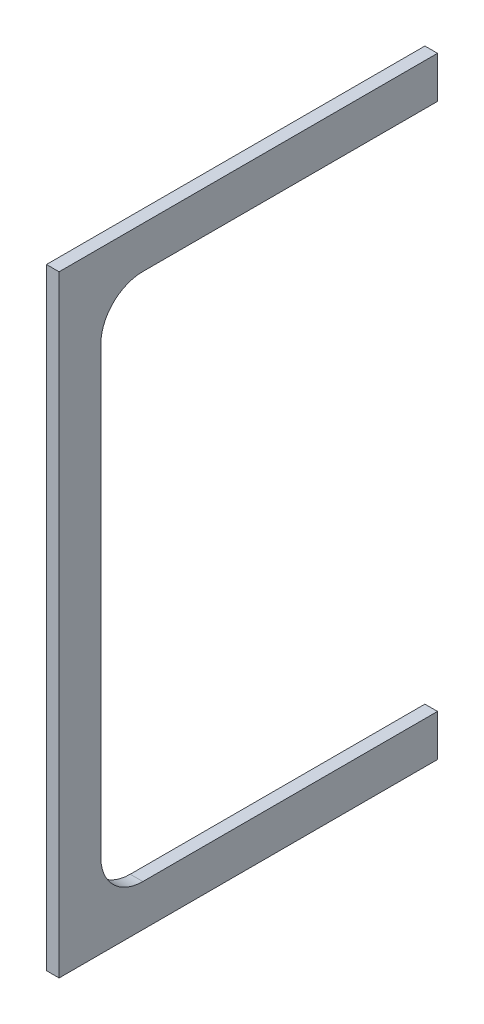
ISO-10303-21;
HEADER;
FILE_DESCRIPTION(('STEP AP214'),'2;1');
FILE_NAME('part.step','',(''),(''),'','','');
FILE_SCHEMA(('AUTOMOTIVE_DESIGN { 1 0 10303 214 1 1 1 1 }'));
ENDSEC;
DATA;
#1=APPLICATION_CONTEXT('core data for automotive mechanical design processes');
#2=APPLICATION_PROTOCOL_DEFINITION('international standard','automotive_design',2000,#1);
#3=PRODUCT_CONTEXT('',#1,'mechanical');
#4=PRODUCT('Part','Part','',(#3));
#5=PRODUCT_RELATED_PRODUCT_CATEGORY('part','',(#4));
#6=PRODUCT_DEFINITION_FORMATION('','',#4);
#7=PRODUCT_DEFINITION_CONTEXT('part definition',#1,'design');
#8=PRODUCT_DEFINITION('design','',#6,#7);
#9=PRODUCT_DEFINITION_SHAPE('','',#8);
#10=(LENGTH_UNIT() NAMED_UNIT(*) SI_UNIT(.MILLI.,.METRE.));
#11=(NAMED_UNIT(*) PLANE_ANGLE_UNIT() SI_UNIT($,.RADIAN.));
#12=(NAMED_UNIT(*) SI_UNIT($,.STERADIAN.) SOLID_ANGLE_UNIT());
#13=UNCERTAINTY_MEASURE_WITH_UNIT(LENGTH_MEASURE(1.E-05),#10,'distance_accuracy_value','');
#14=(GEOMETRIC_REPRESENTATION_CONTEXT(3) GLOBAL_UNCERTAINTY_ASSIGNED_CONTEXT((#13)) GLOBAL_UNIT_ASSIGNED_CONTEXT((#10,
#11,#12)) REPRESENTATION_CONTEXT('',''));
#15=CARTESIAN_POINT('',(0.,0.,0.));
#16=DIRECTION('',(0.,0.,1.));
#17=DIRECTION('',(1.,0.,0.));
#18=AXIS2_PLACEMENT_3D('',#15,#16,#17);
#19=CARTESIAN_POINT('',(1.5,148.4,-36.5));
#20=DIRECTION('',(0.,0.,-1.));
#21=DIRECTION('',(-1.,0.,0.));
#22=AXIS2_PLACEMENT_3D('',#19,#20,#21);
#23=PLANE('',#22);
#24=DIRECTION('',(0.,-1.,0.));
#25=VECTOR('',#24,1.);
#26=CARTESIAN_POINT('',(-1.5,148.4,-36.5));
#27=LINE('',#26,#25);
#28=CARTESIAN_POINT('',(-1.5,148.4,-36.5));
#29=VERTEX_POINT('',#28);
#30=CARTESIAN_POINT('',(-1.5,138.5,-36.5));
#31=VERTEX_POINT('',#30);
#32=EDGE_CURVE('E145',#29,#31,#27,.T.);
#33=ORIENTED_EDGE('',*,*,#32,.F.);
#34=DIRECTION('',(-1.,0.,0.));
#35=VECTOR('',#34,1.);
#36=CARTESIAN_POINT('',(1.5,148.4,-36.5));
#37=LINE('',#36,#35);
#38=CARTESIAN_POINT('',(1.5,148.4,-36.5));
#39=VERTEX_POINT('',#38);
#40=EDGE_CURVE('E11',#39,#29,#37,.T.);
#41=ORIENTED_EDGE('',*,*,#40,.F.);
#42=DIRECTION('',(0.,-1.,0.));
#43=VECTOR('',#42,1.);
#44=CARTESIAN_POINT('',(1.5,148.4,-36.5));
#45=LINE('',#44,#43);
#46=CARTESIAN_POINT('',(1.5,138.5,-36.5));
#47=VERTEX_POINT('',#46);
#48=EDGE_CURVE('E171',#39,#47,#45,.T.);
#49=ORIENTED_EDGE('',*,*,#48,.T.);
#50=DIRECTION('',(-1.,0.,0.));
#51=VECTOR('',#50,1.);
#52=CARTESIAN_POINT('',(1.5,138.5,-36.5));
#53=LINE('',#52,#51);
#54=EDGE_CURVE('E39',#47,#31,#53,.T.);
#55=ORIENTED_EDGE('',*,*,#54,.T.);
#56=EDGE_LOOP('',(#33,#41,#49,#55));
#57=FACE_BOUND('',#56,.T.);
#58=ADVANCED_FACE('F36',(#57),#23,.T.);
#59=CARTESIAN_POINT('',(1.5,148.4,53.4));
#60=DIRECTION('',(0.,1.,0.));
#61=DIRECTION('',(-1.,0.,0.));
#62=AXIS2_PLACEMENT_3D('',#59,#60,#61);
#63=PLANE('',#62);
#64=DIRECTION('',(0.,0.,-1.));
#65=VECTOR('',#64,1.);
#66=CARTESIAN_POINT('',(-1.5,148.4,53.4));
#67=LINE('',#66,#65);
#68=CARTESIAN_POINT('',(-1.5,148.4,53.4));
#69=VERTEX_POINT('',#68);
#70=EDGE_CURVE('E169',#69,#29,#67,.T.);
#71=ORIENTED_EDGE('',*,*,#70,.F.);
#72=DIRECTION('',(-1.,0.,0.));
#73=VECTOR('',#72,1.);
#74=CARTESIAN_POINT('',(1.5,148.4,53.4));
#75=LINE('',#74,#73);
#76=CARTESIAN_POINT('',(1.5,148.4,53.4));
#77=VERTEX_POINT('',#76);
#78=EDGE_CURVE('E45',#77,#69,#75,.T.);
#79=ORIENTED_EDGE('',*,*,#78,.F.);
#80=DIRECTION('',(0.,0.,-1.));
#81=VECTOR('',#80,1.);
#82=CARTESIAN_POINT('',(1.5,148.4,53.4));
#83=LINE('',#82,#81);
#84=EDGE_CURVE('E135',#77,#39,#83,.T.);
#85=ORIENTED_EDGE('',*,*,#84,.T.);
#86=ORIENTED_EDGE('',*,*,#40,.T.);
#87=EDGE_LOOP('',(#71,#79,#85,#86));
#88=FACE_BOUND('',#87,.T.);
#89=ADVANCED_FACE('F187',(#88),#63,.T.);
#90=CARTESIAN_POINT('',(1.5,3.1,53.4));
#91=DIRECTION('',(0.,0.,1.));
#92=DIRECTION('',(1.,0.,0.));
#93=AXIS2_PLACEMENT_3D('',#90,#91,#92);
#94=PLANE('',#93);
#95=DIRECTION('',(0.,1.,0.));
#96=VECTOR('',#95,1.);
#97=CARTESIAN_POINT('',(-1.5,3.1,53.4));
#98=LINE('',#97,#96);
#99=CARTESIAN_POINT('',(-1.5,3.1,53.4));
#100=VERTEX_POINT('',#99);
#101=EDGE_CURVE('E122',#100,#69,#98,.T.);
#102=ORIENTED_EDGE('',*,*,#101,.F.);
#103=DIRECTION('',(-1.,0.,0.));
#104=VECTOR('',#103,1.);
#105=CARTESIAN_POINT('',(1.5,3.1,53.4));
#106=LINE('',#105,#104);
#107=CARTESIAN_POINT('',(1.5,3.1,53.4));
#108=VERTEX_POINT('',#107);
#109=EDGE_CURVE('E117',#108,#100,#106,.T.);
#110=ORIENTED_EDGE('',*,*,#109,.F.);
#111=DIRECTION('',(0.,1.,0.));
#112=VECTOR('',#111,1.);
#113=CARTESIAN_POINT('',(1.5,3.1,53.4));
#114=LINE('',#113,#112);
#115=EDGE_CURVE('E120',#108,#77,#114,.T.);
#116=ORIENTED_EDGE('',*,*,#115,.T.);
#117=ORIENTED_EDGE('',*,*,#78,.T.);
#118=EDGE_LOOP('',(#102,#110,#116,#117));
#119=FACE_BOUND('',#118,.T.);
#120=ADVANCED_FACE('F119',(#119),#94,.T.);
#121=CARTESIAN_POINT('',(1.5,3.1,-36.5));
#122=DIRECTION('',(0.,-1.,0.));
#123=DIRECTION('',(1.,0.,0.));
#124=AXIS2_PLACEMENT_3D('',#121,#122,#123);
#125=PLANE('',#124);
#126=DIRECTION('',(0.,0.,1.));
#127=VECTOR('',#126,1.);
#128=CARTESIAN_POINT('',(-1.5,3.1,-36.5));
#129=LINE('',#128,#127);
#130=CARTESIAN_POINT('',(-1.5,3.1,-36.5));
#131=VERTEX_POINT('',#130);
#132=EDGE_CURVE('E166',#131,#100,#129,.T.);
#133=ORIENTED_EDGE('',*,*,#132,.F.);
#134=DIRECTION('',(-1.,0.,0.));
#135=VECTOR('',#134,1.);
#136=CARTESIAN_POINT('',(1.5,3.1,-36.5));
#137=LINE('',#136,#135);
#138=CARTESIAN_POINT('',(1.5,3.1,-36.5));
#139=VERTEX_POINT('',#138);
#140=EDGE_CURVE('E127',#139,#131,#137,.T.);
#141=ORIENTED_EDGE('',*,*,#140,.F.);
#142=DIRECTION('',(0.,0.,1.));
#143=VECTOR('',#142,1.);
#144=CARTESIAN_POINT('',(1.5,3.1,-36.5));
#145=LINE('',#144,#143);
#146=EDGE_CURVE('E133',#139,#108,#145,.T.);
#147=ORIENTED_EDGE('',*,*,#146,.T.);
#148=ORIENTED_EDGE('',*,*,#109,.T.);
#149=EDGE_LOOP('',(#133,#141,#147,#148));
#150=FACE_BOUND('',#149,.T.);
#151=ADVANCED_FACE('F137',(#150),#125,.T.);
#152=CARTESIAN_POINT('',(1.5,13.,-36.5));
#153=DIRECTION('',(0.,0.,-1.));
#154=DIRECTION('',(-1.,0.,0.));
#155=AXIS2_PLACEMENT_3D('',#152,#153,#154);
#156=PLANE('',#155);
#157=DIRECTION('',(0.,-1.,0.));
#158=VECTOR('',#157,1.);
#159=CARTESIAN_POINT('',(-1.5,13.,-36.5));
#160=LINE('',#159,#158);
#161=CARTESIAN_POINT('',(-1.5,13.,-36.5));
#162=VERTEX_POINT('',#161);
#163=EDGE_CURVE('E163',#162,#131,#160,.T.);
#164=ORIENTED_EDGE('',*,*,#163,.F.);
#165=DIRECTION('',(-1.,0.,0.));
#166=VECTOR('',#165,1.);
#167=CARTESIAN_POINT('',(1.5,13.,-36.5));
#168=LINE('',#167,#166);
#169=CARTESIAN_POINT('',(1.5,13.,-36.5));
#170=VERTEX_POINT('',#169);
#171=EDGE_CURVE('E175',#170,#162,#168,.T.);
#172=ORIENTED_EDGE('',*,*,#171,.F.);
#173=DIRECTION('',(0.,-1.,0.));
#174=VECTOR('',#173,1.);
#175=CARTESIAN_POINT('',(1.5,13.,-36.5));
#176=LINE('',#175,#174);
#177=EDGE_CURVE('E138',#170,#139,#176,.T.);
#178=ORIENTED_EDGE('',*,*,#177,.T.);
#179=ORIENTED_EDGE('',*,*,#140,.T.);
#180=EDGE_LOOP('',(#164,#172,#178,#179));
#181=FACE_BOUND('',#180,.T.);
#182=ADVANCED_FACE('F200',(#181),#156,.T.);
#183=CARTESIAN_POINT('',(1.5,13.,33.5));
#184=DIRECTION('',(0.,1.,0.));
#185=DIRECTION('',(-1.,0.,0.));
#186=AXIS2_PLACEMENT_3D('',#183,#184,#185);
#187=PLANE('',#186);
#188=DIRECTION('',(0.,0.,-1.));
#189=VECTOR('',#188,1.);
#190=CARTESIAN_POINT('',(-1.5,13.,33.5));
#191=LINE('',#190,#189);
#192=CARTESIAN_POINT('',(-1.5,13.,33.5));
#193=VERTEX_POINT('',#192);
#194=EDGE_CURVE('E160',#193,#162,#191,.T.);
#195=ORIENTED_EDGE('',*,*,#194,.F.);
#196=DIRECTION('',(-1.,0.,0.));
#197=VECTOR('',#196,1.);
#198=CARTESIAN_POINT('',(1.5,13.,33.5));
#199=LINE('',#198,#197);
#200=CARTESIAN_POINT('',(1.5,13.,33.5));
#201=VERTEX_POINT('',#200);
#202=EDGE_CURVE('E177',#201,#193,#199,.T.);
#203=ORIENTED_EDGE('',*,*,#202,.F.);
#204=DIRECTION('',(0.,0.,-1.));
#205=VECTOR('',#204,1.);
#206=CARTESIAN_POINT('',(1.5,13.,33.5));
#207=LINE('',#206,#205);
#208=EDGE_CURVE('E140',#201,#170,#207,.T.);
#209=ORIENTED_EDGE('',*,*,#208,.T.);
#210=ORIENTED_EDGE('',*,*,#171,.T.);
#211=EDGE_LOOP('',(#195,#203,#209,#210));
#212=FACE_BOUND('',#211,.T.);
#213=ADVANCED_FACE('F203',(#212),#187,.T.);
#214=CARTESIAN_POINT('',(1.5,23.,33.5));
#215=DIRECTION('',(-1.,0.,0.));
#216=DIRECTION('',(0.,-1.,0.));
#217=AXIS2_PLACEMENT_3D('',#214,#215,#216);
#218=CYLINDRICAL_SURFACE('',#217,10.);
#219=CARTESIAN_POINT('',(-1.5,23.,33.5));
#220=DIRECTION('',(1.,0.,0.));
#221=DIRECTION('',(0.,1.,0.));
#222=AXIS2_PLACEMENT_3D('',#219,#220,#221);
#223=CIRCLE('',#222,10.);
#224=CARTESIAN_POINT('',(-1.5,23.,43.5));
#225=VERTEX_POINT('',#224);
#226=EDGE_CURVE('E157',#225,#193,#223,.T.);
#227=ORIENTED_EDGE('',*,*,#226,.F.);
#228=DIRECTION('',(-1.,0.,0.));
#229=VECTOR('',#228,1.);
#230=CARTESIAN_POINT('',(1.5,23.,43.5));
#231=LINE('',#230,#229);
#232=CARTESIAN_POINT('',(1.5,23.,43.5));
#233=VERTEX_POINT('',#232);
#234=EDGE_CURVE('E179',#233,#225,#231,.T.);
#235=ORIENTED_EDGE('',*,*,#234,.F.);
#236=CARTESIAN_POINT('',(1.5,23.,33.5));
#237=DIRECTION('',(1.,0.,0.));
#238=DIRECTION('',(0.,1.,0.));
#239=AXIS2_PLACEMENT_3D('',#236,#237,#238);
#240=CIRCLE('',#239,10.);
#241=EDGE_CURVE('E326',#233,#201,#240,.T.);
#242=ORIENTED_EDGE('',*,*,#241,.T.);
#243=ORIENTED_EDGE('',*,*,#202,.T.);
#244=EDGE_LOOP('',(#227,#235,#242,#243));
#245=FACE_BOUND('',#244,.T.);
#246=ADVANCED_FACE('F207',(#245),#218,.F.);
#247=CARTESIAN_POINT('',(1.5,128.5,43.5));
#248=DIRECTION('',(0.,0.,-1.));
#249=DIRECTION('',(-1.,0.,0.));
#250=AXIS2_PLACEMENT_3D('',#247,#248,#249);
#251=PLANE('',#250);
#252=DIRECTION('',(0.,-1.,0.));
#253=VECTOR('',#252,1.);
#254=CARTESIAN_POINT('',(-1.5,128.5,43.5));
#255=LINE('',#254,#253);
#256=CARTESIAN_POINT('',(-1.5,128.5,43.5));
#257=VERTEX_POINT('',#256);
#258=EDGE_CURVE('E154',#257,#225,#255,.T.);
#259=ORIENTED_EDGE('',*,*,#258,.F.);
#260=DIRECTION('',(-1.,0.,0.));
#261=VECTOR('',#260,1.);
#262=CARTESIAN_POINT('',(1.5,128.5,43.5));
#263=LINE('',#262,#261);
#264=CARTESIAN_POINT('',(1.5,128.5,43.5));
#265=VERTEX_POINT('',#264);
#266=EDGE_CURVE('E181',#265,#257,#263,.T.);
#267=ORIENTED_EDGE('',*,*,#266,.F.);
#268=DIRECTION('',(0.,-1.,0.));
#269=VECTOR('',#268,1.);
#270=CARTESIAN_POINT('',(1.5,128.5,43.5));
#271=LINE('',#270,#269);
#272=EDGE_CURVE('E322',#265,#233,#271,.T.);
#273=ORIENTED_EDGE('',*,*,#272,.T.);
#274=ORIENTED_EDGE('',*,*,#234,.T.);
#275=EDGE_LOOP('',(#259,#267,#273,#274));
#276=FACE_BOUND('',#275,.T.);
#277=ADVANCED_FACE('F211',(#276),#251,.T.);
#278=CARTESIAN_POINT('',(1.5,128.5,33.5));
#279=DIRECTION('',(-1.,0.,0.));
#280=DIRECTION('',(0.,-1.,0.));
#281=AXIS2_PLACEMENT_3D('',#278,#279,#280);
#282=CYLINDRICAL_SURFACE('',#281,10.);
#283=CARTESIAN_POINT('',(-1.5,128.5,33.5));
#284=DIRECTION('',(1.,0.,0.));
#285=DIRECTION('',(0.,1.,0.));
#286=AXIS2_PLACEMENT_3D('',#283,#284,#285);
#287=CIRCLE('',#286,10.);
#288=CARTESIAN_POINT('',(-1.5,138.5,33.5));
#289=VERTEX_POINT('',#288);
#290=EDGE_CURVE('E151',#289,#257,#287,.T.);
#291=ORIENTED_EDGE('',*,*,#290,.F.);
#292=DIRECTION('',(-1.,0.,0.));
#293=VECTOR('',#292,1.);
#294=CARTESIAN_POINT('',(1.5,138.5,33.5));
#295=LINE('',#294,#293);
#296=CARTESIAN_POINT('',(1.5,138.5,33.5));
#297=VERTEX_POINT('',#296);
#298=EDGE_CURVE('E182',#297,#289,#295,.T.);
#299=ORIENTED_EDGE('',*,*,#298,.F.);
#300=CARTESIAN_POINT('',(1.5,128.5,33.5));
#301=DIRECTION('',(1.,0.,0.));
#302=DIRECTION('',(0.,1.,0.));
#303=AXIS2_PLACEMENT_3D('',#300,#301,#302);
#304=CIRCLE('',#303,10.);
#305=EDGE_CURVE('E333',#297,#265,#304,.T.);
#306=ORIENTED_EDGE('',*,*,#305,.T.);
#307=ORIENTED_EDGE('',*,*,#266,.T.);
#308=EDGE_LOOP('',(#291,#299,#306,#307));
#309=FACE_BOUND('',#308,.T.);
#310=ADVANCED_FACE('F215',(#309),#282,.F.);
#311=CARTESIAN_POINT('',(1.5,138.5,-36.5));
#312=DIRECTION('',(0.,-1.,0.));
#313=DIRECTION('',(1.,0.,0.));
#314=AXIS2_PLACEMENT_3D('',#311,#312,#313);
#315=PLANE('',#314);
#316=DIRECTION('',(0.,0.,1.));
#317=VECTOR('',#316,1.);
#318=CARTESIAN_POINT('',(-1.5,138.5,-36.5));
#319=LINE('',#318,#317);
#320=EDGE_CURVE('E148',#31,#289,#319,.T.);
#321=ORIENTED_EDGE('',*,*,#320,.F.);
#322=ORIENTED_EDGE('',*,*,#54,.F.);
#323=DIRECTION('',(0.,0.,1.));
#324=VECTOR('',#323,1.);
#325=CARTESIAN_POINT('',(1.5,138.5,-36.5));
#326=LINE('',#325,#324);
#327=EDGE_CURVE('E335',#47,#297,#326,.T.);
#328=ORIENTED_EDGE('',*,*,#327,.T.);
#329=ORIENTED_EDGE('',*,*,#298,.T.);
#330=EDGE_LOOP('',(#321,#322,#328,#329));
#331=FACE_BOUND('',#330,.T.);
#332=ADVANCED_FACE('F184',(#331),#315,.T.);
#333=CARTESIAN_POINT('',(1.5,128.5,33.5));
#334=DIRECTION('',(1.,0.,0.));
#335=DIRECTION('',(0.,1.,0.));
#336=AXIS2_PLACEMENT_3D('',#333,#334,#335);
#337=PLANE('',#336);
#338=ORIENTED_EDGE('',*,*,#48,.F.);
#339=ORIENTED_EDGE('',*,*,#84,.F.);
#340=ORIENTED_EDGE('',*,*,#115,.F.);
#341=ORIENTED_EDGE('',*,*,#146,.F.);
#342=ORIENTED_EDGE('',*,*,#177,.F.);
#343=ORIENTED_EDGE('',*,*,#208,.F.);
#344=ORIENTED_EDGE('',*,*,#241,.F.);
#345=ORIENTED_EDGE('',*,*,#272,.F.);
#346=ORIENTED_EDGE('',*,*,#305,.F.);
#347=ORIENTED_EDGE('',*,*,#327,.F.);
#348=EDGE_LOOP('',(#338,#339,#340,#341,#342,#343,#344,#345,#346,#347));
#349=FACE_BOUND('',#348,.T.);
#350=ADVANCED_FACE('F131',(#349),#337,.T.);
#351=CARTESIAN_POINT('',(-1.5,128.5,33.5));
#352=DIRECTION('',(1.,0.,0.));
#353=DIRECTION('',(0.,1.,0.));
#354=AXIS2_PLACEMENT_3D('',#351,#352,#353);
#355=PLANE('',#354);
#356=ORIENTED_EDGE('',*,*,#32,.T.);
#357=ORIENTED_EDGE('',*,*,#320,.T.);
#358=ORIENTED_EDGE('',*,*,#290,.T.);
#359=ORIENTED_EDGE('',*,*,#258,.T.);
#360=ORIENTED_EDGE('',*,*,#226,.T.);
#361=ORIENTED_EDGE('',*,*,#194,.T.);
#362=ORIENTED_EDGE('',*,*,#163,.T.);
#363=ORIENTED_EDGE('',*,*,#132,.T.);
#364=ORIENTED_EDGE('',*,*,#101,.T.);
#365=ORIENTED_EDGE('',*,*,#70,.T.);
#366=EDGE_LOOP('',(#356,#357,#358,#359,#360,#361,#362,#363,#364,#365));
#367=FACE_BOUND('',#366,.T.);
#368=ADVANCED_FACE('F186',(#367),#355,.F.);
#369=CLOSED_SHELL('',(#58,#89,#120,#151,#182,#213,#246,#277,#310,#332,#350,#368));
#370=MANIFOLD_SOLID_BREP('B2',#369);
#371=ADVANCED_BREP_SHAPE_REPRESENTATION('',(#18,#370),#14);
#372=SHAPE_DEFINITION_REPRESENTATION(#9,#371);
ENDSEC;
END-ISO-10303-21;
